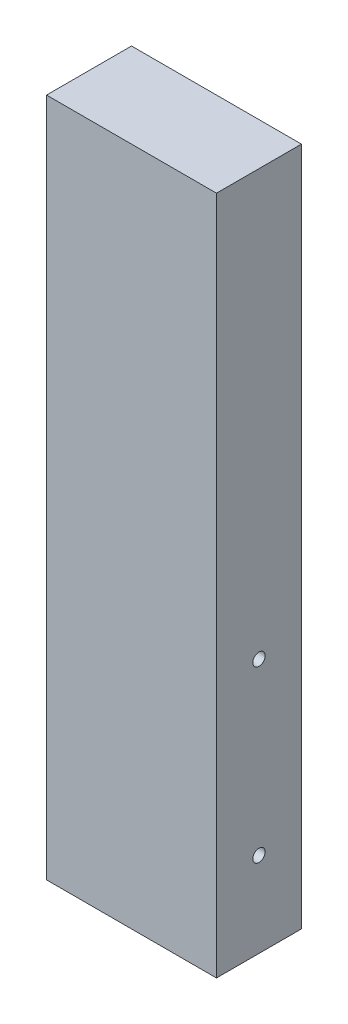
ISO-10303-21;
HEADER;
FILE_DESCRIPTION(('STEP AP214'),'2;1');
FILE_NAME('part.step','',(''),(''),'','','');
FILE_SCHEMA(('AUTOMOTIVE_DESIGN { 1 0 10303 214 1 1 1 1 }'));
ENDSEC;
DATA;
#1=APPLICATION_CONTEXT('core data for automotive mechanical design processes');
#2=APPLICATION_PROTOCOL_DEFINITION('international standard','automotive_design',2000,#1);
#3=PRODUCT_CONTEXT('',#1,'mechanical');
#4=PRODUCT('Part','Part','',(#3));
#5=PRODUCT_RELATED_PRODUCT_CATEGORY('part','',(#4));
#6=PRODUCT_DEFINITION_FORMATION('','',#4);
#7=PRODUCT_DEFINITION_CONTEXT('part definition',#1,'design');
#8=PRODUCT_DEFINITION('design','',#6,#7);
#9=PRODUCT_DEFINITION_SHAPE('','',#8);
#10=(LENGTH_UNIT() NAMED_UNIT(*) SI_UNIT(.MILLI.,.METRE.));
#11=(NAMED_UNIT(*) PLANE_ANGLE_UNIT() SI_UNIT($,.RADIAN.));
#12=(NAMED_UNIT(*) SI_UNIT($,.STERADIAN.) SOLID_ANGLE_UNIT());
#13=UNCERTAINTY_MEASURE_WITH_UNIT(LENGTH_MEASURE(1.E-05),#10,'distance_accuracy_value','');
#14=(GEOMETRIC_REPRESENTATION_CONTEXT(3) GLOBAL_UNCERTAINTY_ASSIGNED_CONTEXT((#13)) GLOBAL_UNIT_ASSIGNED_CONTEXT((#10,
#11,#12)) REPRESENTATION_CONTEXT('',''));
#15=CARTESIAN_POINT('',(0.,0.,0.));
#16=DIRECTION('',(0.,0.,1.));
#17=DIRECTION('',(1.,0.,0.));
#18=AXIS2_PLACEMENT_3D('',#15,#16,#17);
#19=CARTESIAN_POINT('',(95.377,114.3,438.15));
#20=DIRECTION('',(-1.,0.,0.));
#21=DIRECTION('',(0.,-1.,0.));
#22=AXIS2_PLACEMENT_3D('',#19,#20,#21);
#23=PLANE('',#22);
#24=CARTESIAN_POINT('',(95.377,19.05,428.625));
#25=DIRECTION('',(1.,0.,0.));
#26=DIRECTION('',(0.,1.,0.));
#27=AXIS2_PLACEMENT_3D('',#24,#25,#26);
#28=CIRCLE('',#27,1.38906250000009);
#29=CARTESIAN_POINT('',(95.377,20.4390625000001,428.625));
#30=VERTEX_POINT('',#29);
#31=EDGE_CURVE('E130',#30,#30,#28,.T.);
#32=ORIENTED_EDGE('',*,*,#31,.F.);
#33=EDGE_LOOP('',(#32));
#34=FACE_BOUND('',#33,.T.);
#35=CARTESIAN_POINT('',(95.377,-19.05,428.625));
#36=DIRECTION('',(1.,0.,0.));
#37=DIRECTION('',(0.,1.,0.));
#38=AXIS2_PLACEMENT_3D('',#35,#36,#37);
#39=CIRCLE('',#38,1.38906250000009);
#40=CARTESIAN_POINT('',(95.377,-17.6609374999999,428.625));
#41=VERTEX_POINT('',#40);
#42=EDGE_CURVE('E123',#41,#41,#39,.T.);
#43=ORIENTED_EDGE('',*,*,#42,.F.);
#44=EDGE_LOOP('',(#43));
#45=FACE_BOUND('',#44,.T.);
#46=DIRECTION('',(0.,1.,0.));
#47=VECTOR('',#46,1.);
#48=CARTESIAN_POINT('',(95.377,114.3,419.1));
#49=LINE('',#48,#47);
#50=CARTESIAN_POINT('',(95.377,-38.1,419.1));
#51=VERTEX_POINT('',#50);
#52=CARTESIAN_POINT('',(95.377,114.3,419.1));
#53=VERTEX_POINT('',#52);
#54=EDGE_CURVE('E109',#51,#53,#49,.T.);
#55=ORIENTED_EDGE('',*,*,#54,.T.);
#56=DIRECTION('',(0.,0.,-1.));
#57=VECTOR('',#56,1.);
#58=CARTESIAN_POINT('',(95.377,114.3,438.15));
#59=LINE('',#58,#57);
#60=CARTESIAN_POINT('',(95.377,114.3,438.15));
#61=VERTEX_POINT('',#60);
#62=EDGE_CURVE('E13',#61,#53,#59,.T.);
#63=ORIENTED_EDGE('',*,*,#62,.F.);
#64=DIRECTION('',(0.,1.,0.));
#65=VECTOR('',#64,1.);
#66=CARTESIAN_POINT('',(95.377,114.3,438.15));
#67=LINE('',#66,#65);
#68=CARTESIAN_POINT('',(95.377,-38.1,438.15));
#69=VERTEX_POINT('',#68);
#70=EDGE_CURVE('E97',#69,#61,#67,.T.);
#71=ORIENTED_EDGE('',*,*,#70,.F.);
#72=DIRECTION('',(0.,0.,-1.));
#73=VECTOR('',#72,1.);
#74=CARTESIAN_POINT('',(95.377,-38.1,438.15));
#75=LINE('',#74,#73);
#76=EDGE_CURVE('E105',#69,#51,#75,.T.);
#77=ORIENTED_EDGE('',*,*,#76,.T.);
#78=EDGE_LOOP('',(#55,#63,#71,#77));
#79=FACE_BOUND('',#78,.T.);
#80=ADVANCED_FACE('F46',(#34,#45,#79),#23,.F.);
#81=CARTESIAN_POINT('',(95.377,114.3,438.15));
#82=DIRECTION('',(0.,-1.,0.));
#83=DIRECTION('',(0.,0.,-1.));
#84=AXIS2_PLACEMENT_3D('',#81,#82,#83);
#85=PLANE('',#84);
#86=DIRECTION('',(-1.,0.,0.));
#87=VECTOR('',#86,1.);
#88=CARTESIAN_POINT('',(95.377,114.3,419.1));
#89=LINE('',#88,#87);
#90=CARTESIAN_POINT('',(57.277,114.3,419.1));
#91=VERTEX_POINT('',#90);
#92=EDGE_CURVE('E101',#53,#91,#89,.T.);
#93=ORIENTED_EDGE('',*,*,#92,.T.);
#94=DIRECTION('',(0.,0.,-1.));
#95=VECTOR('',#94,1.);
#96=CARTESIAN_POINT('',(57.277,114.3,438.15));
#97=LINE('',#96,#95);
#98=CARTESIAN_POINT('',(57.277,114.3,438.15));
#99=VERTEX_POINT('',#98);
#100=EDGE_CURVE('E54',#99,#91,#97,.T.);
#101=ORIENTED_EDGE('',*,*,#100,.F.);
#102=DIRECTION('',(-1.,0.,0.));
#103=VECTOR('',#102,1.);
#104=CARTESIAN_POINT('',(95.377,114.3,438.15));
#105=LINE('',#104,#103);
#106=EDGE_CURVE('E92',#61,#99,#105,.T.);
#107=ORIENTED_EDGE('',*,*,#106,.F.);
#108=ORIENTED_EDGE('',*,*,#62,.T.);
#109=EDGE_LOOP('',(#93,#101,#107,#108));
#110=FACE_BOUND('',#109,.T.);
#111=ADVANCED_FACE('F100',(#110),#85,.F.);
#112=CARTESIAN_POINT('',(57.277,114.3,438.15));
#113=DIRECTION('',(1.,0.,0.));
#114=DIRECTION('',(0.,1.,0.));
#115=AXIS2_PLACEMENT_3D('',#112,#113,#114);
#116=PLANE('',#115);
#117=CARTESIAN_POINT('',(57.277,-19.05,428.625));
#118=DIRECTION('',(1.,0.,0.));
#119=DIRECTION('',(0.,1.,0.));
#120=AXIS2_PLACEMENT_3D('',#117,#118,#119);
#121=CIRCLE('',#120,1.38906250000009);
#122=CARTESIAN_POINT('',(57.277,-17.6609374999999,428.625));
#123=VERTEX_POINT('',#122);
#124=EDGE_CURVE('E143',#123,#123,#121,.T.);
#125=ORIENTED_EDGE('',*,*,#124,.T.);
#126=EDGE_LOOP('',(#125));
#127=FACE_BOUND('',#126,.T.);
#128=CARTESIAN_POINT('',(57.277,19.05,428.625));
#129=DIRECTION('',(1.,0.,0.));
#130=DIRECTION('',(0.,1.,0.));
#131=AXIS2_PLACEMENT_3D('',#128,#129,#130);
#132=CIRCLE('',#131,1.38906250000009);
#133=CARTESIAN_POINT('',(57.277,20.4390625000001,428.625));
#134=VERTEX_POINT('',#133);
#135=EDGE_CURVE('E137',#134,#134,#132,.T.);
#136=ORIENTED_EDGE('',*,*,#135,.T.);
#137=EDGE_LOOP('',(#136));
#138=FACE_BOUND('',#137,.T.);
#139=DIRECTION('',(0.,-1.,0.));
#140=VECTOR('',#139,1.);
#141=CARTESIAN_POINT('',(57.277,114.3,419.1));
#142=LINE('',#141,#140);
#143=CARTESIAN_POINT('',(57.277,-38.1,419.1));
#144=VERTEX_POINT('',#143);
#145=EDGE_CURVE('E79',#91,#144,#142,.T.);
#146=ORIENTED_EDGE('',*,*,#145,.T.);
#147=DIRECTION('',(0.,0.,-1.));
#148=VECTOR('',#147,1.);
#149=CARTESIAN_POINT('',(57.277,-38.1,438.15));
#150=LINE('',#149,#148);
#151=CARTESIAN_POINT('',(57.277,-38.1,438.15));
#152=VERTEX_POINT('',#151);
#153=EDGE_CURVE('E102',#152,#144,#150,.T.);
#154=ORIENTED_EDGE('',*,*,#153,.F.);
#155=DIRECTION('',(0.,-1.,0.));
#156=VECTOR('',#155,1.);
#157=CARTESIAN_POINT('',(57.277,114.3,438.15));
#158=LINE('',#157,#156);
#159=EDGE_CURVE('E95',#99,#152,#158,.T.);
#160=ORIENTED_EDGE('',*,*,#159,.F.);
#161=ORIENTED_EDGE('',*,*,#100,.T.);
#162=EDGE_LOOP('',(#146,#154,#160,#161));
#163=FACE_BOUND('',#162,.T.);
#164=ADVANCED_FACE('F103',(#127,#138,#163),#116,.F.);
#165=CARTESIAN_POINT('',(95.377,-38.1,438.15));
#166=DIRECTION('',(0.,1.,0.));
#167=DIRECTION('',(0.,0.,1.));
#168=AXIS2_PLACEMENT_3D('',#165,#166,#167);
#169=PLANE('',#168);
#170=DIRECTION('',(1.,0.,0.));
#171=VECTOR('',#170,1.);
#172=CARTESIAN_POINT('',(95.377,-38.1,419.1));
#173=LINE('',#172,#171);
#174=EDGE_CURVE('E85',#144,#51,#173,.T.);
#175=ORIENTED_EDGE('',*,*,#174,.T.);
#176=ORIENTED_EDGE('',*,*,#76,.F.);
#177=DIRECTION('',(1.,0.,0.));
#178=VECTOR('',#177,1.);
#179=CARTESIAN_POINT('',(95.377,-38.1,438.15));
#180=LINE('',#179,#178);
#181=EDGE_CURVE('E62',#152,#69,#180,.T.);
#182=ORIENTED_EDGE('',*,*,#181,.F.);
#183=ORIENTED_EDGE('',*,*,#153,.T.);
#184=EDGE_LOOP('',(#175,#176,#182,#183));
#185=FACE_BOUND('',#184,.T.);
#186=ADVANCED_FACE('F117',(#185),#169,.F.);
#187=CARTESIAN_POINT('',(0.,0.,438.15));
#188=DIRECTION('',(0.,0.,-1.));
#189=DIRECTION('',(-1.,0.,0.));
#190=AXIS2_PLACEMENT_3D('',#187,#188,#189);
#191=PLANE('',#190);
#192=ORIENTED_EDGE('',*,*,#70,.T.);
#193=ORIENTED_EDGE('',*,*,#106,.T.);
#194=ORIENTED_EDGE('',*,*,#159,.T.);
#195=ORIENTED_EDGE('',*,*,#181,.T.);
#196=EDGE_LOOP('',(#192,#193,#194,#195));
#197=FACE_BOUND('',#196,.T.);
#198=ADVANCED_FACE('F93',(#197),#191,.F.);
#199=CARTESIAN_POINT('',(0.,0.,419.1));
#200=DIRECTION('',(0.,0.,-1.));
#201=DIRECTION('',(-1.,0.,0.));
#202=AXIS2_PLACEMENT_3D('',#199,#200,#201);
#203=PLANE('',#202);
#204=CARTESIAN_POINT('',(76.327,-12.7,419.1));
#205=DIRECTION('',(0.,0.,-1.));
#206=DIRECTION('',(-1.,0.,0.));
#207=AXIS2_PLACEMENT_3D('',#204,#205,#206);
#208=CIRCLE('',#207,1.38906249999999);
#209=CARTESIAN_POINT('',(74.9379375,-12.7,419.1));
#210=VERTEX_POINT('',#209);
#211=EDGE_CURVE('E171',#210,#210,#208,.T.);
#212=ORIENTED_EDGE('',*,*,#211,.F.);
#213=EDGE_LOOP('',(#212));
#214=FACE_BOUND('',#213,.T.);
#215=CARTESIAN_POINT('',(76.327,12.7,419.1));
#216=DIRECTION('',(0.,0.,-1.));
#217=DIRECTION('',(-1.,0.,0.));
#218=AXIS2_PLACEMENT_3D('',#215,#216,#217);
#219=CIRCLE('',#218,1.38906249999999);
#220=CARTESIAN_POINT('',(74.9379375,12.7,419.1));
#221=VERTEX_POINT('',#220);
#222=EDGE_CURVE('E165',#221,#221,#219,.T.);
#223=ORIENTED_EDGE('',*,*,#222,.F.);
#224=EDGE_LOOP('',(#223));
#225=FACE_BOUND('',#224,.T.);
#226=CARTESIAN_POINT('',(76.327,38.1,419.1));
#227=DIRECTION('',(0.,0.,-1.));
#228=DIRECTION('',(-1.,0.,0.));
#229=AXIS2_PLACEMENT_3D('',#226,#227,#228);
#230=CIRCLE('',#229,1.38906249999999);
#231=CARTESIAN_POINT('',(74.9379375,38.1,419.1));
#232=VERTEX_POINT('',#231);
#233=EDGE_CURVE('E159',#232,#232,#230,.T.);
#234=ORIENTED_EDGE('',*,*,#233,.F.);
#235=EDGE_LOOP('',(#234));
#236=FACE_BOUND('',#235,.T.);
#237=CARTESIAN_POINT('',(76.327,63.5,419.1));
#238=DIRECTION('',(0.,0.,-1.));
#239=DIRECTION('',(-1.,0.,0.));
#240=AXIS2_PLACEMENT_3D('',#237,#238,#239);
#241=CIRCLE('',#240,1.3890625);
#242=CARTESIAN_POINT('',(74.9379375,63.5,419.1));
#243=VERTEX_POINT('',#242);
#244=EDGE_CURVE('E153',#243,#243,#241,.T.);
#245=ORIENTED_EDGE('',*,*,#244,.F.);
#246=EDGE_LOOP('',(#245));
#247=FACE_BOUND('',#246,.T.);
#248=CARTESIAN_POINT('',(76.327,88.9,419.1));
#249=DIRECTION('',(0.,0.,-1.));
#250=DIRECTION('',(-1.,0.,0.));
#251=AXIS2_PLACEMENT_3D('',#248,#249,#250);
#252=CIRCLE('',#251,1.3890625);
#253=CARTESIAN_POINT('',(74.9379375,88.9,419.1));
#254=VERTEX_POINT('',#253);
#255=EDGE_CURVE('E147',#254,#254,#252,.T.);
#256=ORIENTED_EDGE('',*,*,#255,.F.);
#257=EDGE_LOOP('',(#256));
#258=FACE_BOUND('',#257,.T.);
#259=ORIENTED_EDGE('',*,*,#54,.F.);
#260=ORIENTED_EDGE('',*,*,#174,.F.);
#261=ORIENTED_EDGE('',*,*,#145,.F.);
#262=ORIENTED_EDGE('',*,*,#92,.F.);
#263=EDGE_LOOP('',(#259,#260,#261,#262));
#264=FACE_BOUND('',#263,.T.);
#265=ADVANCED_FACE('F120',(#214,#225,#236,#247,#258,#264),#203,.T.);
#266=CARTESIAN_POINT('',(82.677,-19.05,428.625));
#267=DIRECTION('',(1.,0.,0.));
#268=DIRECTION('',(0.,1.,0.));
#269=AXIS2_PLACEMENT_3D('',#266,#267,#268);
#270=CYLINDRICAL_SURFACE('',#269,1.38906250000009);
#271=CARTESIAN_POINT('',(82.677,-19.05,428.625));
#272=DIRECTION('',(1.,0.,0.));
#273=DIRECTION('',(0.,1.,0.));
#274=AXIS2_PLACEMENT_3D('',#271,#272,#273);
#275=CIRCLE('',#274,1.38906250000009);
#276=CARTESIAN_POINT('',(82.677,-17.6609374999999,428.625));
#277=VERTEX_POINT('',#276);
#278=EDGE_CURVE('E126',#277,#277,#275,.T.);
#279=ORIENTED_EDGE('',*,*,#278,.F.);
#280=EDGE_LOOP('',(#279));
#281=FACE_BOUND('',#280,.T.);
#282=ORIENTED_EDGE('',*,*,#42,.T.);
#283=EDGE_LOOP('',(#282));
#284=FACE_BOUND('',#283,.T.);
#285=ADVANCED_FACE('F188',(#281,#284),#270,.F.);
#286=CARTESIAN_POINT('',(82.677,-19.05,428.625));
#287=DIRECTION('',(1.,0.,0.));
#288=DIRECTION('',(0.,1.,0.));
#289=AXIS2_PLACEMENT_3D('',#286,#287,#288);
#290=PLANE('',#289);
#291=ORIENTED_EDGE('',*,*,#278,.T.);
#292=EDGE_LOOP('',(#291));
#293=FACE_BOUND('',#292,.T.);
#294=ADVANCED_FACE('F225',(#293),#290,.T.);
#295=CARTESIAN_POINT('',(82.677,19.05,428.625));
#296=DIRECTION('',(1.,0.,0.));
#297=DIRECTION('',(0.,1.,0.));
#298=AXIS2_PLACEMENT_3D('',#295,#296,#297);
#299=CYLINDRICAL_SURFACE('',#298,1.38906250000009);
#300=CARTESIAN_POINT('',(82.677,19.05,428.625));
#301=DIRECTION('',(1.,0.,0.));
#302=DIRECTION('',(0.,1.,0.));
#303=AXIS2_PLACEMENT_3D('',#300,#301,#302);
#304=CIRCLE('',#303,1.38906250000009);
#305=CARTESIAN_POINT('',(82.677,20.4390625000001,428.625));
#306=VERTEX_POINT('',#305);
#307=EDGE_CURVE('E112',#306,#306,#304,.T.);
#308=ORIENTED_EDGE('',*,*,#307,.F.);
#309=EDGE_LOOP('',(#308));
#310=FACE_BOUND('',#309,.T.);
#311=ORIENTED_EDGE('',*,*,#31,.T.);
#312=EDGE_LOOP('',(#311));
#313=FACE_BOUND('',#312,.T.);
#314=ADVANCED_FACE('F231',(#310,#313),#299,.F.);
#315=CARTESIAN_POINT('',(82.677,19.05,428.625));
#316=DIRECTION('',(1.,0.,0.));
#317=DIRECTION('',(0.,1.,0.));
#318=AXIS2_PLACEMENT_3D('',#315,#316,#317);
#319=PLANE('',#318);
#320=ORIENTED_EDGE('',*,*,#307,.T.);
#321=EDGE_LOOP('',(#320));
#322=FACE_BOUND('',#321,.T.);
#323=ADVANCED_FACE('F252',(#322),#319,.T.);
#324=CARTESIAN_POINT('',(69.977,19.05,428.625));
#325=DIRECTION('',(-1.,0.,0.));
#326=DIRECTION('',(0.,1.,0.));
#327=AXIS2_PLACEMENT_3D('',#324,#325,#326);
#328=CYLINDRICAL_SURFACE('',#327,1.38906250000009);
#329=CARTESIAN_POINT('',(69.977,19.05,428.625));
#330=DIRECTION('',(1.,0.,0.));
#331=DIRECTION('',(0.,1.,0.));
#332=AXIS2_PLACEMENT_3D('',#329,#330,#331);
#333=CIRCLE('',#332,1.38906250000009);
#334=CARTESIAN_POINT('',(69.977,20.4390625000001,428.625));
#335=VERTEX_POINT('',#334);
#336=EDGE_CURVE('E127',#335,#335,#333,.T.);
#337=ORIENTED_EDGE('',*,*,#336,.T.);
#338=EDGE_LOOP('',(#337));
#339=FACE_BOUND('',#338,.T.);
#340=ORIENTED_EDGE('',*,*,#135,.F.);
#341=EDGE_LOOP('',(#340));
#342=FACE_BOUND('',#341,.T.);
#343=ADVANCED_FACE('F249',(#339,#342),#328,.F.);
#344=CARTESIAN_POINT('',(69.977,19.05,428.625));
#345=DIRECTION('',(-1.,0.,0.));
#346=DIRECTION('',(0.,1.,0.));
#347=AXIS2_PLACEMENT_3D('',#344,#345,#346);
#348=PLANE('',#347);
#349=ORIENTED_EDGE('',*,*,#336,.F.);
#350=EDGE_LOOP('',(#349));
#351=FACE_BOUND('',#350,.T.);
#352=ADVANCED_FACE('F251',(#351),#348,.T.);
#353=CARTESIAN_POINT('',(69.977,-19.05,428.625));
#354=DIRECTION('',(-1.,0.,0.));
#355=DIRECTION('',(0.,1.,0.));
#356=AXIS2_PLACEMENT_3D('',#353,#354,#355);
#357=CYLINDRICAL_SURFACE('',#356,1.38906250000009);
#358=CARTESIAN_POINT('',(69.977,-19.05,428.625));
#359=DIRECTION('',(1.,0.,0.));
#360=DIRECTION('',(0.,1.,0.));
#361=AXIS2_PLACEMENT_3D('',#358,#359,#360);
#362=CIRCLE('',#361,1.38906250000009);
#363=CARTESIAN_POINT('',(69.977,-17.6609374999999,428.625));
#364=VERTEX_POINT('',#363);
#365=EDGE_CURVE('E140',#364,#364,#362,.T.);
#366=ORIENTED_EDGE('',*,*,#365,.T.);
#367=EDGE_LOOP('',(#366));
#368=FACE_BOUND('',#367,.T.);
#369=ORIENTED_EDGE('',*,*,#124,.F.);
#370=EDGE_LOOP('',(#369));
#371=FACE_BOUND('',#370,.T.);
#372=ADVANCED_FACE('F211',(#368,#371),#357,.F.);
#373=CARTESIAN_POINT('',(69.977,-19.05,428.625));
#374=DIRECTION('',(-1.,0.,0.));
#375=DIRECTION('',(0.,1.,0.));
#376=AXIS2_PLACEMENT_3D('',#373,#374,#375);
#377=PLANE('',#376);
#378=ORIENTED_EDGE('',*,*,#365,.F.);
#379=EDGE_LOOP('',(#378));
#380=FACE_BOUND('',#379,.T.);
#381=ADVANCED_FACE('F201',(#380),#377,.T.);
#382=CARTESIAN_POINT('',(76.327,88.9,431.8));
#383=DIRECTION('',(0.,0.,-1.));
#384=DIRECTION('',(-1.,0.,0.));
#385=AXIS2_PLACEMENT_3D('',#382,#383,#384);
#386=CYLINDRICAL_SURFACE('',#385,1.3890625);
#387=CARTESIAN_POINT('',(76.327,88.9,431.8));
#388=DIRECTION('',(0.,0.,-1.));
#389=DIRECTION('',(-1.,0.,0.));
#390=AXIS2_PLACEMENT_3D('',#387,#388,#389);
#391=CIRCLE('',#390,1.3890625);
#392=CARTESIAN_POINT('',(74.9379375,88.9,431.8));
#393=VERTEX_POINT('',#392);
#394=EDGE_CURVE('E150',#393,#393,#391,.T.);
#395=ORIENTED_EDGE('',*,*,#394,.F.);
#396=EDGE_LOOP('',(#395));
#397=FACE_BOUND('',#396,.T.);
#398=ORIENTED_EDGE('',*,*,#255,.T.);
#399=EDGE_LOOP('',(#398));
#400=FACE_BOUND('',#399,.T.);
#401=ADVANCED_FACE('F198',(#397,#400),#386,.F.);
#402=CARTESIAN_POINT('',(76.327,88.9,431.8));
#403=DIRECTION('',(0.,0.,-1.));
#404=DIRECTION('',(-1.,0.,0.));
#405=AXIS2_PLACEMENT_3D('',#402,#403,#404);
#406=PLANE('',#405);
#407=ORIENTED_EDGE('',*,*,#394,.T.);
#408=EDGE_LOOP('',(#407));
#409=FACE_BOUND('',#408,.T.);
#410=ADVANCED_FACE('F200',(#409),#406,.T.);
#411=CARTESIAN_POINT('',(76.327,63.5,431.8));
#412=DIRECTION('',(0.,0.,-1.));
#413=DIRECTION('',(-1.,0.,0.));
#414=AXIS2_PLACEMENT_3D('',#411,#412,#413);
#415=CYLINDRICAL_SURFACE('',#414,1.3890625);
#416=CARTESIAN_POINT('',(76.327,63.5,431.8));
#417=DIRECTION('',(0.,0.,-1.));
#418=DIRECTION('',(-1.,0.,0.));
#419=AXIS2_PLACEMENT_3D('',#416,#417,#418);
#420=CIRCLE('',#419,1.3890625);
#421=CARTESIAN_POINT('',(74.9379375,63.5,431.8));
#422=VERTEX_POINT('',#421);
#423=EDGE_CURVE('E156',#422,#422,#420,.T.);
#424=ORIENTED_EDGE('',*,*,#423,.F.);
#425=EDGE_LOOP('',(#424));
#426=FACE_BOUND('',#425,.T.);
#427=ORIENTED_EDGE('',*,*,#244,.T.);
#428=EDGE_LOOP('',(#427));
#429=FACE_BOUND('',#428,.T.);
#430=ADVANCED_FACE('F208',(#426,#429),#415,.F.);
#431=CARTESIAN_POINT('',(76.327,63.5,431.8));
#432=DIRECTION('',(0.,0.,-1.));
#433=DIRECTION('',(-1.,0.,0.));
#434=AXIS2_PLACEMENT_3D('',#431,#432,#433);
#435=PLANE('',#434);
#436=ORIENTED_EDGE('',*,*,#423,.T.);
#437=EDGE_LOOP('',(#436));
#438=FACE_BOUND('',#437,.T.);
#439=ADVANCED_FACE('F324',(#438),#435,.T.);
#440=CARTESIAN_POINT('',(76.327,38.1,431.8));
#441=DIRECTION('',(0.,0.,-1.));
#442=DIRECTION('',(-1.,0.,0.));
#443=AXIS2_PLACEMENT_3D('',#440,#441,#442);
#444=CYLINDRICAL_SURFACE('',#443,1.38906249999999);
#445=CARTESIAN_POINT('',(76.327,38.1,431.8));
#446=DIRECTION('',(0.,0.,-1.));
#447=DIRECTION('',(-1.,0.,0.));
#448=AXIS2_PLACEMENT_3D('',#445,#446,#447);
#449=CIRCLE('',#448,1.38906249999999);
#450=CARTESIAN_POINT('',(74.9379375,38.1,431.8));
#451=VERTEX_POINT('',#450);
#452=EDGE_CURVE('E162',#451,#451,#449,.T.);
#453=ORIENTED_EDGE('',*,*,#452,.F.);
#454=EDGE_LOOP('',(#453));
#455=FACE_BOUND('',#454,.T.);
#456=ORIENTED_EDGE('',*,*,#233,.T.);
#457=EDGE_LOOP('',(#456));
#458=FACE_BOUND('',#457,.T.);
#459=ADVANCED_FACE('F334',(#455,#458),#444,.F.);
#460=CARTESIAN_POINT('',(76.327,38.1,431.8));
#461=DIRECTION('',(0.,0.,-1.));
#462=DIRECTION('',(-1.,0.,0.));
#463=AXIS2_PLACEMENT_3D('',#460,#461,#462);
#464=PLANE('',#463);
#465=ORIENTED_EDGE('',*,*,#452,.T.);
#466=EDGE_LOOP('',(#465));
#467=FACE_BOUND('',#466,.T.);
#468=ADVANCED_FACE('F344',(#467),#464,.T.);
#469=CARTESIAN_POINT('',(76.327,12.7,431.8));
#470=DIRECTION('',(0.,0.,-1.));
#471=DIRECTION('',(-1.,0.,0.));
#472=AXIS2_PLACEMENT_3D('',#469,#470,#471);
#473=CYLINDRICAL_SURFACE('',#472,1.38906249999999);
#474=CARTESIAN_POINT('',(76.327,12.7,431.8));
#475=DIRECTION('',(0.,0.,-1.));
#476=DIRECTION('',(-1.,0.,0.));
#477=AXIS2_PLACEMENT_3D('',#474,#475,#476);
#478=CIRCLE('',#477,1.38906249999999);
#479=CARTESIAN_POINT('',(74.9379375,12.7,431.8));
#480=VERTEX_POINT('',#479);
#481=EDGE_CURVE('E168',#480,#480,#478,.T.);
#482=ORIENTED_EDGE('',*,*,#481,.F.);
#483=EDGE_LOOP('',(#482));
#484=FACE_BOUND('',#483,.T.);
#485=ORIENTED_EDGE('',*,*,#222,.T.);
#486=EDGE_LOOP('',(#485));
#487=FACE_BOUND('',#486,.T.);
#488=ADVANCED_FACE('F354',(#484,#487),#473,.F.);
#489=CARTESIAN_POINT('',(76.327,12.7,431.8));
#490=DIRECTION('',(0.,0.,-1.));
#491=DIRECTION('',(-1.,0.,0.));
#492=AXIS2_PLACEMENT_3D('',#489,#490,#491);
#493=PLANE('',#492);
#494=ORIENTED_EDGE('',*,*,#481,.T.);
#495=EDGE_LOOP('',(#494));
#496=FACE_BOUND('',#495,.T.);
#497=ADVANCED_FACE('F182',(#496),#493,.T.);
#498=CARTESIAN_POINT('',(76.327,-12.7,431.8));
#499=DIRECTION('',(0.,0.,-1.));
#500=DIRECTION('',(-1.,0.,0.));
#501=AXIS2_PLACEMENT_3D('',#498,#499,#500);
#502=CYLINDRICAL_SURFACE('',#501,1.38906249999999);
#503=CARTESIAN_POINT('',(76.327,-12.7,431.8));
#504=DIRECTION('',(0.,0.,-1.));
#505=DIRECTION('',(-1.,0.,0.));
#506=AXIS2_PLACEMENT_3D('',#503,#504,#505);
#507=CIRCLE('',#506,1.38906249999999);
#508=CARTESIAN_POINT('',(74.9379375,-12.7,431.8));
#509=VERTEX_POINT('',#508);
#510=EDGE_CURVE('E146',#509,#509,#507,.T.);
#511=ORIENTED_EDGE('',*,*,#510,.F.);
#512=EDGE_LOOP('',(#511));
#513=FACE_BOUND('',#512,.T.);
#514=ORIENTED_EDGE('',*,*,#211,.T.);
#515=EDGE_LOOP('',(#514));
#516=FACE_BOUND('',#515,.T.);
#517=ADVANCED_FACE('F179',(#513,#516),#502,.F.);
#518=CARTESIAN_POINT('',(76.327,-12.7,431.8));
#519=DIRECTION('',(0.,0.,-1.));
#520=DIRECTION('',(-1.,0.,0.));
#521=AXIS2_PLACEMENT_3D('',#518,#519,#520);
#522=PLANE('',#521);
#523=ORIENTED_EDGE('',*,*,#510,.T.);
#524=EDGE_LOOP('',(#523));
#525=FACE_BOUND('',#524,.T.);
#526=ADVANCED_FACE('F177',(#525),#522,.T.);
#527=CLOSED_SHELL('',(#80,#111,#164,#186,#198,#265,#285,#294,#314,#323,#343,#352,#372,#381,#401,
#410,#430,#439,#459,#468,#488,#497,#517,#526));
#528=MANIFOLD_SOLID_BREP('B2',#527);
#529=ADVANCED_BREP_SHAPE_REPRESENTATION('',(#18,#528),#14);
#530=SHAPE_DEFINITION_REPRESENTATION(#9,#529);
ENDSEC;
END-ISO-10303-21;
